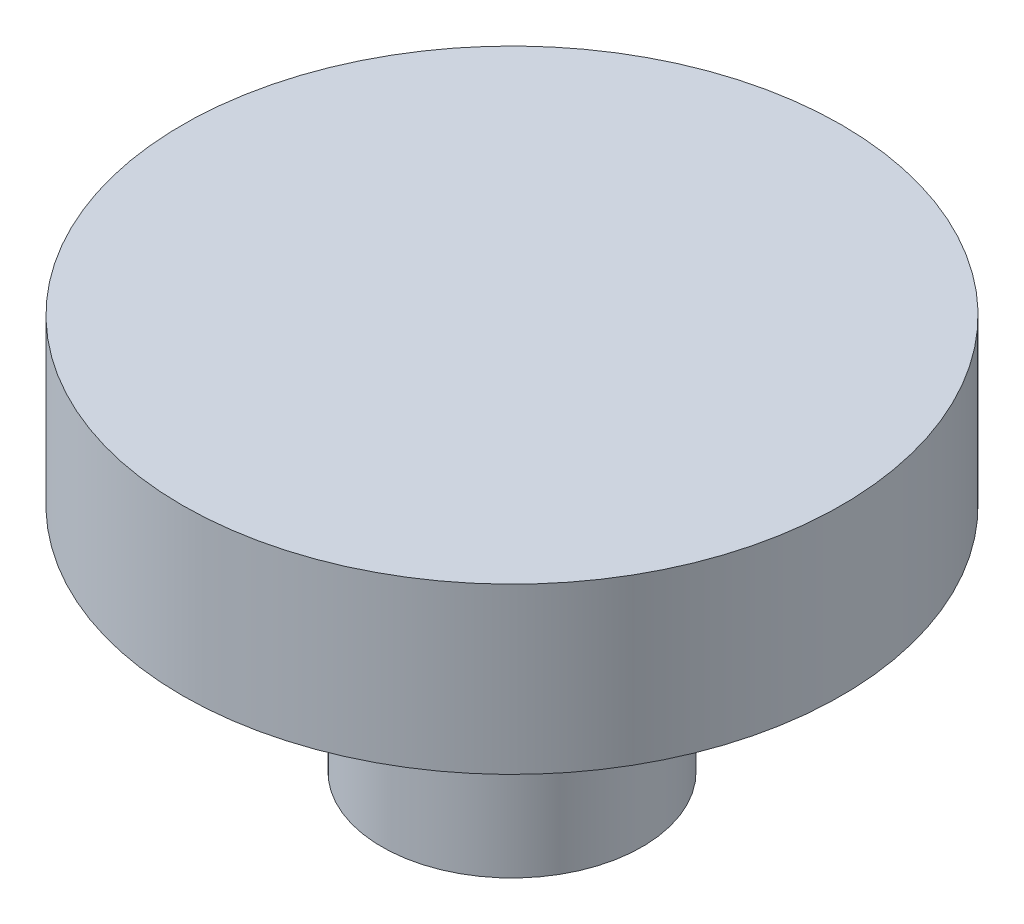
ISO-10303-21;
HEADER;
FILE_DESCRIPTION(('STEP AP214'),'2;1');
FILE_NAME('part.step','',(''),(''),'','','');
FILE_SCHEMA(('AUTOMOTIVE_DESIGN { 1 0 10303 214 1 1 1 1 }'));
ENDSEC;
DATA;
#1=APPLICATION_CONTEXT('core data for automotive mechanical design processes');
#2=APPLICATION_PROTOCOL_DEFINITION('international standard','automotive_design',2000,#1);
#3=PRODUCT_CONTEXT('',#1,'mechanical');
#4=PRODUCT('Part','Part','',(#3));
#5=PRODUCT_RELATED_PRODUCT_CATEGORY('part','',(#4));
#6=PRODUCT_DEFINITION_FORMATION('','',#4);
#7=PRODUCT_DEFINITION_CONTEXT('part definition',#1,'design');
#8=PRODUCT_DEFINITION('design','',#6,#7);
#9=PRODUCT_DEFINITION_SHAPE('','',#8);
#10=(LENGTH_UNIT() NAMED_UNIT(*) SI_UNIT(.MILLI.,.METRE.));
#11=(NAMED_UNIT(*) PLANE_ANGLE_UNIT() SI_UNIT($,.RADIAN.));
#12=(NAMED_UNIT(*) SI_UNIT($,.STERADIAN.) SOLID_ANGLE_UNIT());
#13=UNCERTAINTY_MEASURE_WITH_UNIT(LENGTH_MEASURE(1.E-05),#10,'distance_accuracy_value','');
#14=(GEOMETRIC_REPRESENTATION_CONTEXT(3) GLOBAL_UNCERTAINTY_ASSIGNED_CONTEXT((#13)) GLOBAL_UNIT_ASSIGNED_CONTEXT((#10,
#11,#12)) REPRESENTATION_CONTEXT('',''));
#15=CARTESIAN_POINT('',(0.,0.,0.));
#16=DIRECTION('',(0.,0.,1.));
#17=DIRECTION('',(1.,0.,0.));
#18=AXIS2_PLACEMENT_3D('',#15,#16,#17);
#19=CARTESIAN_POINT('',(-229.979173330466,-5.00000000000106,663.730416707778));
#20=DIRECTION('',(0.,1.,0.));
#21=DIRECTION('',(0.,0.,1.));
#22=AXIS2_PLACEMENT_3D('',#19,#20,#21);
#23=CYLINDRICAL_SURFACE('',#22,10.);
#24=CARTESIAN_POINT('',(-229.979173330466,-5.00000000000106,663.730416707778));
#25=DIRECTION('',(0.,-1.,0.));
#26=DIRECTION('',(0.,0.,-1.));
#27=AXIS2_PLACEMENT_3D('',#24,#25,#26);
#28=CIRCLE('',#27,10.);
#29=CARTESIAN_POINT('',(-229.979173330466,-5.00000000000106,653.730416707778));
#30=VERTEX_POINT('',#29);
#31=EDGE_CURVE('E38',#30,#30,#28,.T.);
#32=ORIENTED_EDGE('',*,*,#31,.F.);
#33=EDGE_LOOP('',(#32));
#34=FACE_BOUND('',#33,.T.);
#35=CARTESIAN_POINT('',(-229.979173330466,-1.0547118733939E-12,663.730416707778));
#36=DIRECTION('',(0.,-1.,0.));
#37=DIRECTION('',(0.,0.,-1.));
#38=AXIS2_PLACEMENT_3D('',#35,#36,#37);
#39=CIRCLE('',#38,10.);
#40=CARTESIAN_POINT('',(-229.979173330466,-1.0547118733939E-12,653.730416707778));
#41=VERTEX_POINT('',#40);
#42=EDGE_CURVE('E34',#41,#41,#39,.T.);
#43=ORIENTED_EDGE('',*,*,#42,.T.);
#44=EDGE_LOOP('',(#43));
#45=FACE_BOUND('',#44,.T.);
#46=ADVANCED_FACE('F31',(#34,#45),#23,.T.);
#47=CARTESIAN_POINT('',(-229.979173330466,-5.00000000000106,663.730416707778));
#48=DIRECTION('',(0.,-1.,0.));
#49=DIRECTION('',(0.,0.,-1.));
#50=AXIS2_PLACEMENT_3D('',#47,#48,#49);
#51=PLANE('',#50);
#52=CARTESIAN_POINT('',(-229.979173330466,-5.00000000000098,663.730416707778));
#53=DIRECTION('',(0.,-1.,0.));
#54=DIRECTION('',(0.,0.,-1.));
#55=AXIS2_PLACEMENT_3D('',#52,#53,#54);
#56=CIRCLE('',#55,3.95);
#57=CARTESIAN_POINT('',(-229.979173330466,-5.00000000000098,659.780416707778));
#58=VERTEX_POINT('',#57);
#59=EDGE_CURVE('E10',#58,#58,#56,.T.);
#60=ORIENTED_EDGE('',*,*,#59,.F.);
#61=EDGE_LOOP('',(#60));
#62=FACE_BOUND('',#61,.T.);
#63=ORIENTED_EDGE('',*,*,#31,.T.);
#64=EDGE_LOOP('',(#63));
#65=FACE_BOUND('',#64,.T.);
#66=ADVANCED_FACE('F55',(#62,#65),#51,.T.);
#67=CARTESIAN_POINT('',(-229.979173330466,-1.0547118733939E-12,663.730416707778));
#68=DIRECTION('',(0.,-1.,0.));
#69=DIRECTION('',(0.,0.,-1.));
#70=AXIS2_PLACEMENT_3D('',#67,#68,#69);
#71=PLANE('',#70);
#72=ORIENTED_EDGE('',*,*,#42,.F.);
#73=EDGE_LOOP('',(#72));
#74=FACE_BOUND('',#73,.T.);
#75=ADVANCED_FACE('F52',(#74),#71,.F.);
#76=CARTESIAN_POINT('',(-229.979173330466,-12.000000000001,663.730416707778));
#77=DIRECTION('',(0.,1.,0.));
#78=DIRECTION('',(0.,0.,1.));
#79=AXIS2_PLACEMENT_3D('',#76,#77,#78);
#80=CYLINDRICAL_SURFACE('',#79,3.95);
#81=CARTESIAN_POINT('',(-229.979173330466,-12.000000000001,663.730416707778));
#82=DIRECTION('',(0.,-1.,0.));
#83=DIRECTION('',(0.,0.,-1.));
#84=AXIS2_PLACEMENT_3D('',#81,#82,#83);
#85=CIRCLE('',#84,3.95);
#86=CARTESIAN_POINT('',(-229.979173330466,-12.000000000001,659.780416707778));
#87=VERTEX_POINT('',#86);
#88=EDGE_CURVE('E44',#87,#87,#85,.T.);
#89=ORIENTED_EDGE('',*,*,#88,.F.);
#90=EDGE_LOOP('',(#89));
#91=FACE_BOUND('',#90,.T.);
#92=ORIENTED_EDGE('',*,*,#59,.T.);
#93=EDGE_LOOP('',(#92));
#94=FACE_BOUND('',#93,.T.);
#95=ADVANCED_FACE('F54',(#91,#94),#80,.T.);
#96=CARTESIAN_POINT('',(-229.979173330466,-12.000000000001,663.730416707778));
#97=DIRECTION('',(0.,-1.,0.));
#98=DIRECTION('',(0.,0.,-1.));
#99=AXIS2_PLACEMENT_3D('',#96,#97,#98);
#100=PLANE('',#99);
#101=ORIENTED_EDGE('',*,*,#88,.T.);
#102=EDGE_LOOP('',(#101));
#103=FACE_BOUND('',#102,.T.);
#104=ADVANCED_FACE('F60',(#103),#100,.T.);
#105=CLOSED_SHELL('',(#46,#66,#75,#95,#104));
#106=MANIFOLD_SOLID_BREP('B2',#105);
#107=ADVANCED_BREP_SHAPE_REPRESENTATION('',(#18,#106),#14);
#108=SHAPE_DEFINITION_REPRESENTATION(#9,#107);
ENDSEC;
END-ISO-10303-21;
